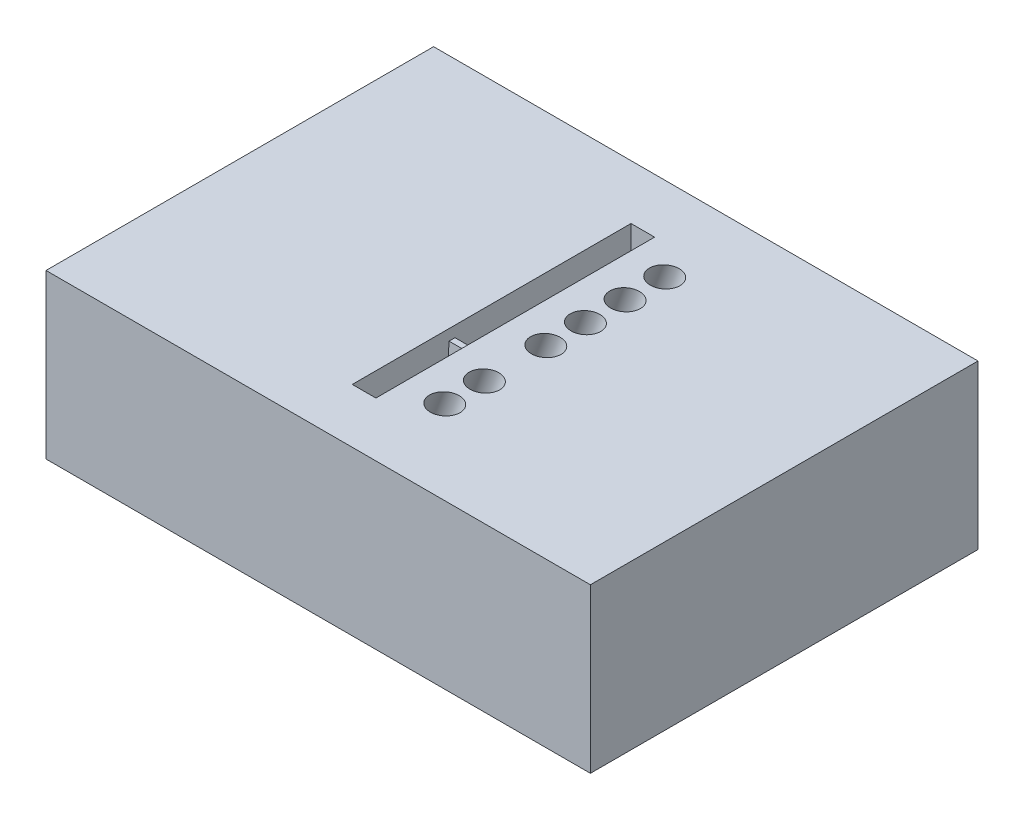
ISO-10303-21;
HEADER;
FILE_DESCRIPTION(('STEP AP214'),'2;1');
FILE_NAME('part.step','',(''),(''),'','','');
FILE_SCHEMA(('AUTOMOTIVE_DESIGN { 1 0 10303 214 1 1 1 1 }'));
ENDSEC;
DATA;
#1=APPLICATION_CONTEXT('core data for automotive mechanical design processes');
#2=APPLICATION_PROTOCOL_DEFINITION('international standard','automotive_design',2000,#1);
#3=PRODUCT_CONTEXT('',#1,'mechanical');
#4=PRODUCT('Part','Part','',(#3));
#5=PRODUCT_RELATED_PRODUCT_CATEGORY('part','',(#4));
#6=PRODUCT_DEFINITION_FORMATION('','',#4);
#7=PRODUCT_DEFINITION_CONTEXT('part definition',#1,'design');
#8=PRODUCT_DEFINITION('design','',#6,#7);
#9=PRODUCT_DEFINITION_SHAPE('','',#8);
#10=(LENGTH_UNIT() NAMED_UNIT(*) SI_UNIT(.MILLI.,.METRE.));
#11=(NAMED_UNIT(*) PLANE_ANGLE_UNIT() SI_UNIT($,.RADIAN.));
#12=(NAMED_UNIT(*) SI_UNIT($,.STERADIAN.) SOLID_ANGLE_UNIT());
#13=UNCERTAINTY_MEASURE_WITH_UNIT(LENGTH_MEASURE(1.E-05),#10,'distance_accuracy_value','');
#14=(GEOMETRIC_REPRESENTATION_CONTEXT(3) GLOBAL_UNCERTAINTY_ASSIGNED_CONTEXT((#13)) GLOBAL_UNIT_ASSIGNED_CONTEXT((#10,
#11,#12)) REPRESENTATION_CONTEXT('',''));
#15=CARTESIAN_POINT('',(0.,0.,0.));
#16=DIRECTION('',(0.,0.,1.));
#17=DIRECTION('',(1.,0.,0.));
#18=AXIS2_PLACEMENT_3D('',#15,#16,#17);
#19=CARTESIAN_POINT('',(0.300000000000002,-10.3,-12.8));
#20=DIRECTION('',(1.,0.,0.));
#21=DIRECTION('',(0.,0.,-1.));
#22=AXIS2_PLACEMENT_3D('',#19,#20,#21);
#23=PLANE('',#22);
#24=DIRECTION('',(0.,-0.998629534754574,0.0523359562429372));
#25=VECTOR('',#24,1.);
#26=CARTESIAN_POINT('',(0.300000000000001,-10.3,4.40036814007895));
#27=LINE('',#26,#25);
#28=CARTESIAN_POINT('',(0.300000000000002,-1.,3.91297579274672));
#29=VERTEX_POINT('',#28);
#30=CARTESIAN_POINT('',(0.300000000000002,-10.3,4.40036814007895));
#31=VERTEX_POINT('',#30);
#32=EDGE_CURVE('E174',#29,#31,#27,.T.);
#33=ORIENTED_EDGE('',*,*,#32,.T.);
#34=DIRECTION('',(0.,0.,-1.));
#35=VECTOR('',#34,1.);
#36=CARTESIAN_POINT('',(0.300000000000002,-10.3,-12.8));
#37=LINE('',#36,#35);
#38=CARTESIAN_POINT('',(0.300000000000002,-10.3,5.65842665136646));
#39=VERTEX_POINT('',#38);
#40=EDGE_CURVE('E767',#39,#31,#37,.T.);
#41=ORIENTED_EDGE('',*,*,#40,.F.);
#42=CARTESIAN_POINT('',(0.300000000000002,-9.9592774582631,6.46000000000001));
#43=DIRECTION('',(1.,0.,0.));
#44=DIRECTION('',(0.,1.,0.));
#45=AXIS2_PLACEMENT_3D('',#42,#43,#44);
#46=ELLIPSE('',#45,2.36828156413211,0.810000000000003);
#47=CARTESIAN_POINT('',(0.300000000000002,-10.3,7.26157334863355));
#48=VERTEX_POINT('',#47);
#49=EDGE_CURVE('E245',#48,#39,#46,.F.);
#50=ORIENTED_EDGE('',*,*,#49,.F.);
#51=CARTESIAN_POINT('',(0.300000000000002,-10.3,9.29842665136647));
#52=VERTEX_POINT('',#51);
#53=EDGE_CURVE('E292',#52,#48,#37,.T.);
#54=ORIENTED_EDGE('',*,*,#53,.F.);
#55=CARTESIAN_POINT('',(0.300000000000002,-9.9592774582631,10.1));
#56=DIRECTION('',(1.,0.,0.));
#57=DIRECTION('',(0.,1.,0.));
#58=AXIS2_PLACEMENT_3D('',#55,#56,#57);
#59=ELLIPSE('',#58,2.3682815641321,0.810000000000002);
#60=CARTESIAN_POINT('',(0.300000000000002,-10.3,10.9015733486336));
#61=VERTEX_POINT('',#60);
#62=EDGE_CURVE('E256',#61,#52,#59,.F.);
#63=ORIENTED_EDGE('',*,*,#62,.F.);
#64=CARTESIAN_POINT('',(0.300000000000002,-10.3,12.8));
#65=VERTEX_POINT('',#64);
#66=EDGE_CURVE('E288',#65,#61,#37,.T.);
#67=ORIENTED_EDGE('',*,*,#66,.F.);
#68=DIRECTION('',(0.,1.,0.));
#69=VECTOR('',#68,1.);
#70=CARTESIAN_POINT('',(0.300000000000002,-10.3,12.8));
#71=LINE('',#70,#69);
#72=CARTESIAN_POINT('',(0.300000000000002,0.,12.8));
#73=VERTEX_POINT('',#72);
#74=EDGE_CURVE('E313',#65,#73,#71,.T.);
#75=ORIENTED_EDGE('',*,*,#74,.T.);
#76=DIRECTION('',(0.,0.,-1.));
#77=VECTOR('',#76,1.);
#78=CARTESIAN_POINT('',(0.300000000000002,0.,-12.8));
#79=LINE('',#78,#77);
#80=CARTESIAN_POINT('',(0.300000000000002,0.,-12.8));
#81=VERTEX_POINT('',#80);
#82=EDGE_CURVE('E302',#73,#81,#79,.T.);
#83=ORIENTED_EDGE('',*,*,#82,.T.);
#84=DIRECTION('',(0.,1.,0.));
#85=VECTOR('',#84,1.);
#86=CARTESIAN_POINT('',(0.300000000000002,-10.3,-12.8));
#87=LINE('',#86,#85);
#88=CARTESIAN_POINT('',(0.300000000000002,-10.3,-12.8));
#89=VERTEX_POINT('',#88);
#90=EDGE_CURVE('E311',#89,#81,#87,.T.);
#91=ORIENTED_EDGE('',*,*,#90,.F.);
#92=CARTESIAN_POINT('',(0.300000000000002,-10.3,-10.9015733486336));
#93=VERTEX_POINT('',#92);
#94=EDGE_CURVE('E287',#93,#89,#37,.T.);
#95=ORIENTED_EDGE('',*,*,#94,.F.);
#96=CARTESIAN_POINT('',(0.300000000000002,-9.9592774582631,-10.1));
#97=DIRECTION('',(1.,0.,0.));
#98=DIRECTION('',(0.,1.,0.));
#99=AXIS2_PLACEMENT_3D('',#96,#97,#98);
#100=ELLIPSE('',#99,2.36828156413211,0.810000000000002);
#101=CARTESIAN_POINT('',(0.300000000000002,-10.3,-9.29842665136647));
#102=VERTEX_POINT('',#101);
#103=EDGE_CURVE('E201',#102,#93,#100,.F.);
#104=ORIENTED_EDGE('',*,*,#103,.F.);
#105=CARTESIAN_POINT('',(0.300000000000002,-10.3,-7.26157334863355));
#106=VERTEX_POINT('',#105);
#107=EDGE_CURVE('E765',#106,#102,#37,.T.);
#108=ORIENTED_EDGE('',*,*,#107,.F.);
#109=CARTESIAN_POINT('',(0.300000000000002,-9.9592774582631,-6.46000000000001));
#110=DIRECTION('',(1.,0.,0.));
#111=DIRECTION('',(0.,1.,0.));
#112=AXIS2_PLACEMENT_3D('',#109,#110,#111);
#113=ELLIPSE('',#112,2.36828156413211,0.810000000000002);
#114=CARTESIAN_POINT('',(0.300000000000002,-10.3,-5.65842665136647));
#115=VERTEX_POINT('',#114);
#116=EDGE_CURVE('E212',#115,#106,#113,.F.);
#117=ORIENTED_EDGE('',*,*,#116,.F.);
#118=CARTESIAN_POINT('',(0.300000000000002,-10.3,-3.62157334863355));
#119=VERTEX_POINT('',#118);
#120=EDGE_CURVE('E766',#119,#115,#37,.T.);
#121=ORIENTED_EDGE('',*,*,#120,.F.);
#122=CARTESIAN_POINT('',(0.300000000000002,-9.9592774582631,-2.82));
#123=DIRECTION('',(1.,0.,0.));
#124=DIRECTION('',(0.,1.,0.));
#125=AXIS2_PLACEMENT_3D('',#122,#123,#124);
#126=ELLIPSE('',#125,2.36828156413211,0.810000000000003);
#127=CARTESIAN_POINT('',(0.300000000000002,-10.3,-2.01842665136646));
#128=VERTEX_POINT('',#127);
#129=EDGE_CURVE('E223',#128,#119,#126,.F.);
#130=ORIENTED_EDGE('',*,*,#129,.F.);
#131=CARTESIAN_POINT('',(0.300000000000002,-10.3,0.0184266513664592));
#132=VERTEX_POINT('',#131);
#133=EDGE_CURVE('E768',#132,#128,#37,.T.);
#134=ORIENTED_EDGE('',*,*,#133,.F.);
#135=CARTESIAN_POINT('',(0.300000000000002,-9.9592774582631,0.820000000000001));
#136=DIRECTION('',(1.,0.,0.));
#137=DIRECTION('',(0.,1.,0.));
#138=AXIS2_PLACEMENT_3D('',#135,#136,#137);
#139=ELLIPSE('',#138,2.36828156413211,0.810000000000003);
#140=CARTESIAN_POINT('',(0.300000000000002,-10.3,1.62157334863354));
#141=VERTEX_POINT('',#140);
#142=EDGE_CURVE('E234',#141,#132,#139,.F.);
#143=ORIENTED_EDGE('',*,*,#142,.F.);
#144=CARTESIAN_POINT('',(0.300000000000002,-10.3,2.87963185992106));
#145=VERTEX_POINT('',#144);
#146=EDGE_CURVE('E293',#145,#141,#37,.T.);
#147=ORIENTED_EDGE('',*,*,#146,.F.);
#148=DIRECTION('',(0.,0.998629534754574,0.052335956242937));
#149=VECTOR('',#148,1.);
#150=CARTESIAN_POINT('',(0.300000000000001,-1.,3.36702420725328));
#151=LINE('',#150,#149);
#152=CARTESIAN_POINT('',(0.300000000000002,-1.,3.36702420725328));
#153=VERTEX_POINT('',#152);
#154=EDGE_CURVE('E50',#145,#153,#151,.T.);
#155=ORIENTED_EDGE('',*,*,#154,.T.);
#156=DIRECTION('',(0.,0.,1.));
#157=VECTOR('',#156,1.);
#158=CARTESIAN_POINT('',(0.300000000000001,-1.,3.91297579274673));
#159=LINE('',#158,#157);
#160=EDGE_CURVE('E55',#153,#29,#159,.T.);
#161=ORIENTED_EDGE('',*,*,#160,.T.);
#162=EDGE_LOOP('',(#33,#41,#50,#54,#63,#67,#75,#83,#91,#95,#104,#108,#117,#121,#130,#134,#143,
#147,#155,#161));
#163=FACE_BOUND('',#162,.T.);
#164=ADVANCED_FACE('F33',(#163),#23,.F.);
#165=CARTESIAN_POINT('',(0.,-10.3,0.));
#166=DIRECTION('',(0.,1.,0.));
#167=DIRECTION('',(0.,0.,1.));
#168=AXIS2_PLACEMENT_3D('',#165,#166,#167);
#169=PLANE('',#168);
#170=ORIENTED_EDGE('',*,*,#40,.T.);
#171=DIRECTION('',(-1.,0.,0.));
#172=VECTOR('',#171,1.);
#173=CARTESIAN_POINT('',(0.300000000000001,-10.3,4.40036814007895));
#174=LINE('',#173,#172);
#175=CARTESIAN_POINT('',(-1.87,-10.3,4.40036814007895));
#176=VERTEX_POINT('',#175);
#177=EDGE_CURVE('E190',#31,#176,#174,.T.);
#178=ORIENTED_EDGE('',*,*,#177,.T.);
#179=DIRECTION('',(0.,0.,1.));
#180=VECTOR('',#179,1.);
#181=CARTESIAN_POINT('',(-1.87,-10.3,-12.8));
#182=LINE('',#181,#180);
#183=CARTESIAN_POINT('',(-1.87,-10.3,12.8));
#184=VERTEX_POINT('',#183);
#185=EDGE_CURVE('E166',#176,#184,#182,.T.);
#186=ORIENTED_EDGE('',*,*,#185,.T.);
#187=DIRECTION('',(1.,0.,0.));
#188=VECTOR('',#187,1.);
#189=CARTESIAN_POINT('',(-1.87,-10.3,12.8));
#190=LINE('',#189,#188);
#191=EDGE_CURVE('E284',#184,#65,#190,.T.);
#192=ORIENTED_EDGE('',*,*,#191,.T.);
#193=ORIENTED_EDGE('',*,*,#66,.T.);
#194=CARTESIAN_POINT('',(0.175987136664245,-10.3,10.1));
#195=DIRECTION('',(0.,1.,0.));
#196=DIRECTION('',(1.,0.,0.));
#197=AXIS2_PLACEMENT_3D('',#194,#195,#196);
#198=ELLIPSE('',#197,0.861983995705491,0.810000000000002);
#199=EDGE_CURVE('E251',#61,#52,#198,.F.);
#200=ORIENTED_EDGE('',*,*,#199,.T.);
#201=ORIENTED_EDGE('',*,*,#53,.T.);
#202=CARTESIAN_POINT('',(0.175987136664245,-10.3,6.46000000000001));
#203=DIRECTION('',(0.,1.,0.));
#204=DIRECTION('',(1.,0.,0.));
#205=AXIS2_PLACEMENT_3D('',#202,#203,#204);
#206=ELLIPSE('',#205,0.861983995705492,0.810000000000003);
#207=EDGE_CURVE('E240',#48,#39,#206,.F.);
#208=ORIENTED_EDGE('',*,*,#207,.T.);
#209=EDGE_LOOP('',(#170,#178,#186,#192,#193,#200,#201,#208));
#210=FACE_BOUND('',#209,.T.);
#211=ADVANCED_FACE('F400',(#210),#169,.T.);
#212=CARTESIAN_POINT('',(-1.87,-10.3,-12.8));
#213=VERTEX_POINT('',#212);
#214=CARTESIAN_POINT('',(-1.87,-10.3,2.87963185992106));
#215=VERTEX_POINT('',#214);
#216=EDGE_CURVE('E281',#213,#215,#182,.T.);
#217=ORIENTED_EDGE('',*,*,#216,.T.);
#218=DIRECTION('',(-1.,0.,0.));
#219=VECTOR('',#218,1.);
#220=CARTESIAN_POINT('',(0.300000000000001,-10.3,2.87963185992106));
#221=LINE('',#220,#219);
#222=EDGE_CURVE('E187',#145,#215,#221,.T.);
#223=ORIENTED_EDGE('',*,*,#222,.F.);
#224=ORIENTED_EDGE('',*,*,#146,.T.);
#225=CARTESIAN_POINT('',(0.175987136664245,-10.3,0.820000000000001));
#226=DIRECTION('',(0.,1.,0.));
#227=DIRECTION('',(1.,0.,0.));
#228=AXIS2_PLACEMENT_3D('',#225,#226,#227);
#229=ELLIPSE('',#228,0.861983995705492,0.810000000000003);
#230=EDGE_CURVE('E229',#141,#132,#229,.F.);
#231=ORIENTED_EDGE('',*,*,#230,.T.);
#232=ORIENTED_EDGE('',*,*,#133,.T.);
#233=CARTESIAN_POINT('',(0.175987136664245,-10.3,-2.82));
#234=DIRECTION('',(0.,1.,0.));
#235=DIRECTION('',(1.,0.,0.));
#236=AXIS2_PLACEMENT_3D('',#233,#234,#235);
#237=ELLIPSE('',#236,0.861983995705492,0.810000000000003);
#238=EDGE_CURVE('E218',#128,#119,#237,.F.);
#239=ORIENTED_EDGE('',*,*,#238,.T.);
#240=ORIENTED_EDGE('',*,*,#120,.T.);
#241=CARTESIAN_POINT('',(0.175987136664245,-10.3,-6.46000000000001));
#242=DIRECTION('',(0.,1.,0.));
#243=DIRECTION('',(1.,0.,0.));
#244=AXIS2_PLACEMENT_3D('',#241,#242,#243);
#245=ELLIPSE('',#244,0.861983995705491,0.810000000000002);
#246=EDGE_CURVE('E207',#115,#106,#245,.F.);
#247=ORIENTED_EDGE('',*,*,#246,.T.);
#248=ORIENTED_EDGE('',*,*,#107,.T.);
#249=CARTESIAN_POINT('',(0.175987136664245,-10.3,-10.1));
#250=DIRECTION('',(0.,1.,0.));
#251=DIRECTION('',(1.,0.,0.));
#252=AXIS2_PLACEMENT_3D('',#249,#250,#251);
#253=ELLIPSE('',#252,0.861983995705491,0.810000000000002);
#254=EDGE_CURVE('E196',#102,#93,#253,.F.);
#255=ORIENTED_EDGE('',*,*,#254,.T.);
#256=ORIENTED_EDGE('',*,*,#94,.T.);
#257=DIRECTION('',(-1.,0.,0.));
#258=VECTOR('',#257,1.);
#259=CARTESIAN_POINT('',(-1.87,-10.3,-12.8));
#260=LINE('',#259,#258);
#261=EDGE_CURVE('E291',#89,#213,#260,.T.);
#262=ORIENTED_EDGE('',*,*,#261,.T.);
#263=EDGE_LOOP('',(#217,#223,#224,#231,#232,#239,#240,#247,#248,#255,#256,#262));
#264=FACE_BOUND('',#263,.T.);
#265=ADVANCED_FACE('F405',(#264),#169,.T.);
#266=CARTESIAN_POINT('',(-1.87,-10.3,-12.8));
#267=DIRECTION('',(-1.,0.,0.));
#268=DIRECTION('',(0.,0.,1.));
#269=AXIS2_PLACEMENT_3D('',#266,#267,#268);
#270=PLANE('',#269);
#271=DIRECTION('',(0.,-0.998629534754574,0.0523359562429372));
#272=VECTOR('',#271,1.);
#273=CARTESIAN_POINT('',(-1.87,-10.3,4.40036814007895));
#274=LINE('',#273,#272);
#275=CARTESIAN_POINT('',(-1.87,-1.,3.91297579274673));
#276=VERTEX_POINT('',#275);
#277=EDGE_CURVE('E159',#276,#176,#274,.T.);
#278=ORIENTED_EDGE('',*,*,#277,.F.);
#279=DIRECTION('',(0.,0.,1.));
#280=VECTOR('',#279,1.);
#281=CARTESIAN_POINT('',(-1.87,-1.,3.91297579274673));
#282=LINE('',#281,#280);
#283=CARTESIAN_POINT('',(-1.87,-1.,3.36702420725328));
#284=VERTEX_POINT('',#283);
#285=EDGE_CURVE('E163',#284,#276,#282,.T.);
#286=ORIENTED_EDGE('',*,*,#285,.F.);
#287=DIRECTION('',(0.,0.998629534754574,0.052335956242937));
#288=VECTOR('',#287,1.);
#289=CARTESIAN_POINT('',(-1.87,-1.,3.36702420725328));
#290=LINE('',#289,#288);
#291=EDGE_CURVE('E169',#215,#284,#290,.T.);
#292=ORIENTED_EDGE('',*,*,#291,.F.);
#293=ORIENTED_EDGE('',*,*,#216,.F.);
#294=DIRECTION('',(0.,1.,0.));
#295=VECTOR('',#294,1.);
#296=CARTESIAN_POINT('',(-1.87,-10.3,-12.8));
#297=LINE('',#296,#295);
#298=CARTESIAN_POINT('',(-1.87,0.,-12.8));
#299=VERTEX_POINT('',#298);
#300=EDGE_CURVE('E308',#213,#299,#297,.T.);
#301=ORIENTED_EDGE('',*,*,#300,.T.);
#302=DIRECTION('',(0.,0.,1.));
#303=VECTOR('',#302,1.);
#304=CARTESIAN_POINT('',(-1.87,0.,-12.8));
#305=LINE('',#304,#303);
#306=CARTESIAN_POINT('',(-1.87,0.,12.8));
#307=VERTEX_POINT('',#306);
#308=EDGE_CURVE('E297',#299,#307,#305,.T.);
#309=ORIENTED_EDGE('',*,*,#308,.T.);
#310=DIRECTION('',(0.,1.,0.));
#311=VECTOR('',#310,1.);
#312=CARTESIAN_POINT('',(-1.87,-10.3,12.8));
#313=LINE('',#312,#311);
#314=EDGE_CURVE('E296',#184,#307,#313,.T.);
#315=ORIENTED_EDGE('',*,*,#314,.F.);
#316=ORIENTED_EDGE('',*,*,#185,.F.);
#317=EDGE_LOOP('',(#278,#286,#292,#293,#301,#309,#315,#316));
#318=FACE_BOUND('',#317,.T.);
#319=ADVANCED_FACE('F161',(#318),#270,.F.);
#320=CARTESIAN_POINT('',(2.28504078760609,-4.50542271761894,-10.1));
#321=DIRECTION('',(-0.342020143325669,-0.939692620785908,0.));
#322=DIRECTION('',(0.939692620785908,-0.342020143325669,0.));
#323=AXIS2_PLACEMENT_3D('',#320,#321,#322);
#324=PLANE('',#323);
#325=CARTESIAN_POINT('',(2.28504078760609,-4.50542271761894,-10.1));
#326=DIRECTION('',(-0.342020143325669,-0.939692620785908,0.));
#327=DIRECTION('',(0.939692620785908,-0.342020143325669,0.));
#328=AXIS2_PLACEMENT_3D('',#325,#326,#327);
#329=CIRCLE('',#328,1.32);
#330=CARTESIAN_POINT('',(3.5254350470435,-4.95688930680883,-10.1));
#331=VERTEX_POINT('',#330);
#332=EDGE_CURVE('E277',#331,#331,#329,.T.);
#333=ORIENTED_EDGE('',*,*,#332,.F.);
#334=EDGE_LOOP('',(#333));
#335=FACE_BOUND('',#334,.T.);
#336=CARTESIAN_POINT('',(2.28504078760609,-4.50542271761894,-10.1));
#337=DIRECTION('',(-0.342020143325669,-0.939692620785908,0.));
#338=DIRECTION('',(0.939692620785908,-0.342020143325669,0.));
#339=AXIS2_PLACEMENT_3D('',#336,#337,#338);
#340=CIRCLE('',#339,0.810000000000002);
#341=CARTESIAN_POINT('',(3.04619181044268,-4.78245903371274,-10.1));
#342=VERTEX_POINT('',#341);
#343=EDGE_CURVE('E192',#342,#342,#340,.T.);
#344=ORIENTED_EDGE('',*,*,#343,.T.);
#345=EDGE_LOOP('',(#344));
#346=FACE_BOUND('',#345,.T.);
#347=ADVANCED_FACE('F415',(#335,#346),#324,.F.);
#348=CARTESIAN_POINT('',(2.28504078760609,-4.50542271761894,-6.46000000000001));
#349=DIRECTION('',(-0.342020143325669,-0.939692620785908,0.));
#350=DIRECTION('',(0.939692620785908,-0.342020143325669,0.));
#351=AXIS2_PLACEMENT_3D('',#348,#349,#350);
#352=PLANE('',#351);
#353=CARTESIAN_POINT('',(2.28504078760609,-4.50542271761894,-6.46000000000001));
#354=DIRECTION('',(-0.342020143325669,-0.939692620785908,0.));
#355=DIRECTION('',(0.939692620785908,-0.342020143325669,0.));
#356=AXIS2_PLACEMENT_3D('',#353,#354,#355);
#357=CIRCLE('',#356,1.32);
#358=CARTESIAN_POINT('',(3.5254350470435,-4.95688930680883,-6.46000000000001));
#359=VERTEX_POINT('',#358);
#360=EDGE_CURVE('E269',#359,#359,#357,.T.);
#361=ORIENTED_EDGE('',*,*,#360,.F.);
#362=EDGE_LOOP('',(#361));
#363=FACE_BOUND('',#362,.T.);
#364=CARTESIAN_POINT('',(2.28504078760609,-4.50542271761894,-6.46000000000001));
#365=DIRECTION('',(-0.342020143325669,-0.939692620785908,0.));
#366=DIRECTION('',(0.939692620785908,-0.342020143325669,0.));
#367=AXIS2_PLACEMENT_3D('',#364,#365,#366);
#368=CIRCLE('',#367,0.810000000000002);
#369=CARTESIAN_POINT('',(3.04619181044268,-4.78245903371274,-6.46000000000001));
#370=VERTEX_POINT('',#369);
#371=EDGE_CURVE('E203',#370,#370,#368,.T.);
#372=ORIENTED_EDGE('',*,*,#371,.T.);
#373=EDGE_LOOP('',(#372));
#374=FACE_BOUND('',#373,.T.);
#375=ADVANCED_FACE('F420',(#363,#374),#352,.F.);
#376=CARTESIAN_POINT('',(2.28504078760609,-4.50542271761894,-2.82));
#377=DIRECTION('',(-0.342020143325669,-0.939692620785908,0.));
#378=DIRECTION('',(0.939692620785908,-0.342020143325669,0.));
#379=AXIS2_PLACEMENT_3D('',#376,#377,#378);
#380=PLANE('',#379);
#381=CARTESIAN_POINT('',(2.28504078760609,-4.50542271761894,-2.82));
#382=DIRECTION('',(-0.342020143325669,-0.939692620785908,0.));
#383=DIRECTION('',(0.939692620785908,-0.342020143325669,0.));
#384=AXIS2_PLACEMENT_3D('',#381,#382,#383);
#385=CIRCLE('',#384,1.32);
#386=CARTESIAN_POINT('',(3.5254350470435,-4.95688930680883,-2.82));
#387=VERTEX_POINT('',#386);
#388=EDGE_CURVE('E273',#387,#387,#385,.T.);
#389=ORIENTED_EDGE('',*,*,#388,.F.);
#390=EDGE_LOOP('',(#389));
#391=FACE_BOUND('',#390,.T.);
#392=CARTESIAN_POINT('',(2.28504078760609,-4.50542271761894,-2.82));
#393=DIRECTION('',(-0.342020143325669,-0.939692620785908,0.));
#394=DIRECTION('',(0.939692620785908,-0.342020143325669,0.));
#395=AXIS2_PLACEMENT_3D('',#392,#393,#394);
#396=CIRCLE('',#395,0.810000000000003);
#397=CARTESIAN_POINT('',(3.04619181044268,-4.78245903371274,-2.82));
#398=VERTEX_POINT('',#397);
#399=EDGE_CURVE('E214',#398,#398,#396,.T.);
#400=ORIENTED_EDGE('',*,*,#399,.T.);
#401=EDGE_LOOP('',(#400));
#402=FACE_BOUND('',#401,.T.);
#403=ADVANCED_FACE('F435',(#391,#402),#380,.F.);
#404=CARTESIAN_POINT('',(2.28504078760609,-4.50542271761894,0.820000000000002));
#405=DIRECTION('',(-0.342020143325669,-0.939692620785908,0.));
#406=DIRECTION('',(0.939692620785908,-0.342020143325669,0.));
#407=AXIS2_PLACEMENT_3D('',#404,#405,#406);
#408=PLANE('',#407);
#409=CARTESIAN_POINT('',(2.28504078760609,-4.50542271761894,0.820000000000002));
#410=DIRECTION('',(-0.342020143325669,-0.939692620785908,0.));
#411=DIRECTION('',(0.939692620785908,-0.342020143325669,0.));
#412=AXIS2_PLACEMENT_3D('',#409,#410,#411);
#413=CIRCLE('',#412,1.32);
#414=CARTESIAN_POINT('',(3.5254350470435,-4.95688930680883,0.820000000000002));
#415=VERTEX_POINT('',#414);
#416=EDGE_CURVE('E265',#415,#415,#413,.T.);
#417=ORIENTED_EDGE('',*,*,#416,.F.);
#418=EDGE_LOOP('',(#417));
#419=FACE_BOUND('',#418,.T.);
#420=CARTESIAN_POINT('',(2.28504078760609,-4.50542271761894,0.820000000000002));
#421=DIRECTION('',(-0.342020143325669,-0.939692620785908,0.));
#422=DIRECTION('',(0.939692620785908,-0.342020143325669,0.));
#423=AXIS2_PLACEMENT_3D('',#420,#421,#422);
#424=CIRCLE('',#423,0.810000000000003);
#425=CARTESIAN_POINT('',(3.04619181044268,-4.78245903371274,0.820000000000002));
#426=VERTEX_POINT('',#425);
#427=EDGE_CURVE('E225',#426,#426,#424,.T.);
#428=ORIENTED_EDGE('',*,*,#427,.T.);
#429=EDGE_LOOP('',(#428));
#430=FACE_BOUND('',#429,.T.);
#431=ADVANCED_FACE('F438',(#419,#430),#408,.F.);
#432=CARTESIAN_POINT('',(2.28504078760609,-4.50542271761895,6.46000000000001));
#433=DIRECTION('',(-0.342020143325669,-0.939692620785908,0.));
#434=DIRECTION('',(0.939692620785908,-0.342020143325669,0.));
#435=AXIS2_PLACEMENT_3D('',#432,#433,#434);
#436=PLANE('',#435);
#437=CARTESIAN_POINT('',(2.28504078760609,-4.50542271761895,6.46000000000001));
#438=DIRECTION('',(-0.342020143325669,-0.939692620785908,0.));
#439=DIRECTION('',(0.939692620785908,-0.342020143325669,0.));
#440=AXIS2_PLACEMENT_3D('',#437,#438,#439);
#441=CIRCLE('',#440,1.32);
#442=CARTESIAN_POINT('',(3.5254350470435,-4.95688930680883,6.46000000000001));
#443=VERTEX_POINT('',#442);
#444=EDGE_CURVE('E261',#443,#443,#441,.T.);
#445=ORIENTED_EDGE('',*,*,#444,.F.);
#446=EDGE_LOOP('',(#445));
#447=FACE_BOUND('',#446,.T.);
#448=CARTESIAN_POINT('',(2.28504078760609,-4.50542271761895,6.46000000000001));
#449=DIRECTION('',(-0.342020143325669,-0.939692620785908,0.));
#450=DIRECTION('',(0.939692620785908,-0.342020143325669,0.));
#451=AXIS2_PLACEMENT_3D('',#448,#449,#450);
#452=CIRCLE('',#451,0.810000000000003);
#453=CARTESIAN_POINT('',(3.04619181044268,-4.78245903371274,6.46000000000001));
#454=VERTEX_POINT('',#453);
#455=EDGE_CURVE('E236',#454,#454,#452,.T.);
#456=ORIENTED_EDGE('',*,*,#455,.T.);
#457=EDGE_LOOP('',(#456));
#458=FACE_BOUND('',#457,.T.);
#459=ADVANCED_FACE('F452',(#447,#458),#436,.F.);
#460=CARTESIAN_POINT('',(2.28504078760609,-4.50542271761895,10.1));
#461=DIRECTION('',(-0.342020143325669,-0.939692620785908,0.));
#462=DIRECTION('',(0.939692620785908,-0.342020143325669,0.));
#463=AXIS2_PLACEMENT_3D('',#460,#461,#462);
#464=PLANE('',#463);
#465=CARTESIAN_POINT('',(2.28504078760609,-4.50542271761895,10.1));
#466=DIRECTION('',(-0.342020143325669,-0.939692620785908,0.));
#467=DIRECTION('',(0.939692620785908,-0.342020143325669,0.));
#468=AXIS2_PLACEMENT_3D('',#465,#466,#467);
#469=CIRCLE('',#468,1.32);
#470=CARTESIAN_POINT('',(3.5254350470435,-4.95688930680883,10.1));
#471=VERTEX_POINT('',#470);
#472=EDGE_CURVE('E258',#471,#471,#469,.T.);
#473=ORIENTED_EDGE('',*,*,#472,.F.);
#474=EDGE_LOOP('',(#473));
#475=FACE_BOUND('',#474,.T.);
#476=CARTESIAN_POINT('',(2.28504078760609,-4.50542271761895,10.1));
#477=DIRECTION('',(-0.342020143325669,-0.939692620785908,0.));
#478=DIRECTION('',(0.939692620785908,-0.342020143325669,0.));
#479=AXIS2_PLACEMENT_3D('',#476,#477,#478);
#480=CIRCLE('',#479,0.810000000000002);
#481=CARTESIAN_POINT('',(3.04619181044268,-4.78245903371274,10.1));
#482=VERTEX_POINT('',#481);
#483=EDGE_CURVE('E247',#482,#482,#480,.T.);
#484=ORIENTED_EDGE('',*,*,#483,.T.);
#485=EDGE_LOOP('',(#484));
#486=FACE_BOUND('',#485,.T.);
#487=ADVANCED_FACE('F459',(#475,#486),#464,.F.);
#488=CARTESIAN_POINT('',(25.,-15.,17.8));
#489=DIRECTION('',(1.,0.,0.));
#490=DIRECTION('',(0.,0.,-1.));
#491=AXIS2_PLACEMENT_3D('',#488,#489,#490);
#492=PLANE('',#491);
#493=DIRECTION('',(0.,0.,-1.));
#494=VECTOR('',#493,1.);
#495=CARTESIAN_POINT('',(25.,0.,17.8));
#496=LINE('',#495,#494);
#497=CARTESIAN_POINT('',(25.,0.,17.8));
#498=VERTEX_POINT('',#497);
#499=CARTESIAN_POINT('',(25.,0.,-17.8));
#500=VERTEX_POINT('',#499);
#501=EDGE_CURVE('E310',#498,#500,#496,.T.);
#502=ORIENTED_EDGE('',*,*,#501,.F.);
#503=DIRECTION('',(0.,1.,0.));
#504=VECTOR('',#503,1.);
#505=CARTESIAN_POINT('',(25.,-15.,17.8));
#506=LINE('',#505,#504);
#507=CARTESIAN_POINT('',(25.,-15.,17.8));
#508=VERTEX_POINT('',#507);
#509=EDGE_CURVE('E11',#508,#498,#506,.T.);
#510=ORIENTED_EDGE('',*,*,#509,.F.);
#511=DIRECTION('',(0.,0.,-1.));
#512=VECTOR('',#511,1.);
#513=CARTESIAN_POINT('',(25.,-15.,17.8));
#514=LINE('',#513,#512);
#515=CARTESIAN_POINT('',(25.,-15.,-17.8));
#516=VERTEX_POINT('',#515);
#517=EDGE_CURVE('E317',#508,#516,#514,.T.);
#518=ORIENTED_EDGE('',*,*,#517,.T.);
#519=DIRECTION('',(0.,1.,0.));
#520=VECTOR('',#519,1.);
#521=CARTESIAN_POINT('',(25.,-15.,-17.8));
#522=LINE('',#521,#520);
#523=EDGE_CURVE('E330',#516,#500,#522,.T.);
#524=ORIENTED_EDGE('',*,*,#523,.T.);
#525=EDGE_LOOP('',(#502,#510,#518,#524));
#526=FACE_BOUND('',#525,.T.);
#527=ADVANCED_FACE('F35',(#526),#492,.T.);
#528=CARTESIAN_POINT('',(25.,-15.,17.8));
#529=DIRECTION('',(0.,0.,1.));
#530=DIRECTION('',(1.,0.,0.));
#531=AXIS2_PLACEMENT_3D('',#528,#529,#530);
#532=PLANE('',#531);
#533=DIRECTION('',(1.,0.,0.));
#534=VECTOR('',#533,1.);
#535=CARTESIAN_POINT('',(25.,0.,17.8));
#536=LINE('',#535,#534);
#537=CARTESIAN_POINT('',(-25.,0.,17.8));
#538=VERTEX_POINT('',#537);
#539=EDGE_CURVE('E321',#538,#498,#536,.T.);
#540=ORIENTED_EDGE('',*,*,#539,.F.);
#541=DIRECTION('',(0.,1.,0.));
#542=VECTOR('',#541,1.);
#543=CARTESIAN_POINT('',(-25.,-15.,17.8));
#544=LINE('',#543,#542);
#545=CARTESIAN_POINT('',(-25.,-15.,17.8));
#546=VERTEX_POINT('',#545);
#547=EDGE_CURVE('E42',#546,#538,#544,.T.);
#548=ORIENTED_EDGE('',*,*,#547,.F.);
#549=DIRECTION('',(1.,0.,0.));
#550=VECTOR('',#549,1.);
#551=CARTESIAN_POINT('',(25.,-15.,17.8));
#552=LINE('',#551,#550);
#553=EDGE_CURVE('E327',#546,#508,#552,.T.);
#554=ORIENTED_EDGE('',*,*,#553,.T.);
#555=ORIENTED_EDGE('',*,*,#509,.T.);
#556=EDGE_LOOP('',(#540,#548,#554,#555));
#557=FACE_BOUND('',#556,.T.);
#558=ADVANCED_FACE('F390',(#557),#532,.T.);
#559=CARTESIAN_POINT('',(-25.,-15.,17.8));
#560=DIRECTION('',(-1.,0.,0.));
#561=DIRECTION('',(0.,0.,1.));
#562=AXIS2_PLACEMENT_3D('',#559,#560,#561);
#563=PLANE('',#562);
#564=DIRECTION('',(0.,0.,1.));
#565=VECTOR('',#564,1.);
#566=CARTESIAN_POINT('',(-25.,0.,17.8));
#567=LINE('',#566,#565);
#568=CARTESIAN_POINT('',(-25.,0.,-17.8));
#569=VERTEX_POINT('',#568);
#570=EDGE_CURVE('E336',#569,#538,#567,.T.);
#571=ORIENTED_EDGE('',*,*,#570,.F.);
#572=DIRECTION('',(0.,1.,0.));
#573=VECTOR('',#572,1.);
#574=CARTESIAN_POINT('',(-25.,-15.,-17.8));
#575=LINE('',#574,#573);
#576=CARTESIAN_POINT('',(-25.,-15.,-17.8));
#577=VERTEX_POINT('',#576);
#578=EDGE_CURVE('E342',#577,#569,#575,.T.);
#579=ORIENTED_EDGE('',*,*,#578,.F.);
#580=DIRECTION('',(0.,0.,1.));
#581=VECTOR('',#580,1.);
#582=CARTESIAN_POINT('',(-25.,-15.,17.8));
#583=LINE('',#582,#581);
#584=EDGE_CURVE('E324',#577,#546,#583,.T.);
#585=ORIENTED_EDGE('',*,*,#584,.T.);
#586=ORIENTED_EDGE('',*,*,#547,.T.);
#587=EDGE_LOOP('',(#571,#579,#585,#586));
#588=FACE_BOUND('',#587,.T.);
#589=ADVANCED_FACE('F388',(#588),#563,.T.);
#590=CARTESIAN_POINT('',(25.,-15.,-17.8));
#591=DIRECTION('',(0.,0.,-1.));
#592=DIRECTION('',(-1.,0.,0.));
#593=AXIS2_PLACEMENT_3D('',#590,#591,#592);
#594=PLANE('',#593);
#595=DIRECTION('',(-1.,0.,0.));
#596=VECTOR('',#595,1.);
#597=CARTESIAN_POINT('',(25.,0.,-17.8));
#598=LINE('',#597,#596);
#599=EDGE_CURVE('E333',#500,#569,#598,.T.);
#600=ORIENTED_EDGE('',*,*,#599,.F.);
#601=ORIENTED_EDGE('',*,*,#523,.F.);
#602=DIRECTION('',(-1.,0.,0.));
#603=VECTOR('',#602,1.);
#604=CARTESIAN_POINT('',(25.,-15.,-17.8));
#605=LINE('',#604,#603);
#606=EDGE_CURVE('E320',#516,#577,#605,.T.);
#607=ORIENTED_EDGE('',*,*,#606,.T.);
#608=ORIENTED_EDGE('',*,*,#578,.T.);
#609=EDGE_LOOP('',(#600,#601,#607,#608));
#610=FACE_BOUND('',#609,.T.);
#611=ADVANCED_FACE('F384',(#610),#594,.T.);
#612=CARTESIAN_POINT('',(0.,-15.,0.));
#613=DIRECTION('',(0.,1.,0.));
#614=DIRECTION('',(0.,0.,1.));
#615=AXIS2_PLACEMENT_3D('',#612,#613,#614);
#616=PLANE('',#615);
#617=ORIENTED_EDGE('',*,*,#517,.F.);
#618=ORIENTED_EDGE('',*,*,#553,.F.);
#619=ORIENTED_EDGE('',*,*,#584,.F.);
#620=ORIENTED_EDGE('',*,*,#606,.F.);
#621=EDGE_LOOP('',(#617,#618,#619,#620));
#622=FACE_BOUND('',#621,.T.);
#623=ADVANCED_FACE('F362',(#622),#616,.F.);
#624=CARTESIAN_POINT('',(0.,0.,0.));
#625=DIRECTION('',(0.,1.,0.));
#626=DIRECTION('',(0.,0.,1.));
#627=AXIS2_PLACEMENT_3D('',#624,#625,#626);
#628=PLANE('',#627);
#629=CARTESIAN_POINT('',(3.92488054960613,0.,10.1));
#630=DIRECTION('',(0.,1.,0.));
#631=DIRECTION('',(-1.,0.,0.));
#632=AXIS2_PLACEMENT_3D('',#629,#630,#631);
#633=ELLIPSE('',#632,1.40471465966821,1.32);
#634=CARTESIAN_POINT('',(2.52016588993793,0.,10.1));
#635=VERTEX_POINT('',#634);
#636=EDGE_CURVE('E37',#635,#635,#633,.T.);
#637=ORIENTED_EDGE('',*,*,#636,.F.);
#638=EDGE_LOOP('',(#637));
#639=FACE_BOUND('',#638,.T.);
#640=CARTESIAN_POINT('',(3.92488054960613,0.,6.46000000000001));
#641=DIRECTION('',(0.,1.,0.));
#642=DIRECTION('',(-1.,0.,0.));
#643=AXIS2_PLACEMENT_3D('',#640,#641,#642);
#644=ELLIPSE('',#643,1.40471465966821,1.32);
#645=CARTESIAN_POINT('',(2.52016588993793,0.,6.46000000000001));
#646=VERTEX_POINT('',#645);
#647=EDGE_CURVE('E264',#646,#646,#644,.T.);
#648=ORIENTED_EDGE('',*,*,#647,.F.);
#649=EDGE_LOOP('',(#648));
#650=FACE_BOUND('',#649,.T.);
#651=CARTESIAN_POINT('',(3.92488054960613,0.,0.820000000000003));
#652=DIRECTION('',(0.,1.,0.));
#653=DIRECTION('',(-1.,0.,0.));
#654=AXIS2_PLACEMENT_3D('',#651,#652,#653);
#655=ELLIPSE('',#654,1.40471465966821,1.32);
#656=CARTESIAN_POINT('',(2.52016588993793,0.,0.820000000000002));
#657=VERTEX_POINT('',#656);
#658=EDGE_CURVE('E268',#657,#657,#655,.T.);
#659=ORIENTED_EDGE('',*,*,#658,.F.);
#660=EDGE_LOOP('',(#659));
#661=FACE_BOUND('',#660,.T.);
#662=CARTESIAN_POINT('',(3.92488054960613,0.,-6.46000000000001));
#663=DIRECTION('',(0.,1.,0.));
#664=DIRECTION('',(-1.,0.,0.));
#665=AXIS2_PLACEMENT_3D('',#662,#663,#664);
#666=ELLIPSE('',#665,1.40471465966821,1.32);
#667=CARTESIAN_POINT('',(2.52016588993792,0.,-6.46000000000001));
#668=VERTEX_POINT('',#667);
#669=EDGE_CURVE('E272',#668,#668,#666,.T.);
#670=ORIENTED_EDGE('',*,*,#669,.F.);
#671=EDGE_LOOP('',(#670));
#672=FACE_BOUND('',#671,.T.);
#673=CARTESIAN_POINT('',(3.92488054960613,0.,-2.82));
#674=DIRECTION('',(0.,1.,0.));
#675=DIRECTION('',(-1.,0.,0.));
#676=AXIS2_PLACEMENT_3D('',#673,#674,#675);
#677=ELLIPSE('',#676,1.40471465966821,1.32);
#678=CARTESIAN_POINT('',(2.52016588993792,0.,-2.82));
#679=VERTEX_POINT('',#678);
#680=EDGE_CURVE('E276',#679,#679,#677,.T.);
#681=ORIENTED_EDGE('',*,*,#680,.F.);
#682=EDGE_LOOP('',(#681));
#683=FACE_BOUND('',#682,.T.);
#684=CARTESIAN_POINT('',(3.92488054960613,0.,-10.1));
#685=DIRECTION('',(0.,1.,0.));
#686=DIRECTION('',(-1.,0.,0.));
#687=AXIS2_PLACEMENT_3D('',#684,#685,#686);
#688=ELLIPSE('',#687,1.40471465966821,1.32);
#689=CARTESIAN_POINT('',(2.52016588993793,0.,-10.1));
#690=VERTEX_POINT('',#689);
#691=EDGE_CURVE('E280',#690,#690,#688,.T.);
#692=ORIENTED_EDGE('',*,*,#691,.F.);
#693=EDGE_LOOP('',(#692));
#694=FACE_BOUND('',#693,.T.);
#695=ORIENTED_EDGE('',*,*,#308,.F.);
#696=DIRECTION('',(-1.,0.,0.));
#697=VECTOR('',#696,1.);
#698=CARTESIAN_POINT('',(-1.87,0.,-12.8));
#699=LINE('',#698,#697);
#700=EDGE_CURVE('E305',#81,#299,#699,.T.);
#701=ORIENTED_EDGE('',*,*,#700,.F.);
#702=ORIENTED_EDGE('',*,*,#82,.F.);
#703=DIRECTION('',(1.,0.,0.));
#704=VECTOR('',#703,1.);
#705=CARTESIAN_POINT('',(-1.87,0.,12.8));
#706=LINE('',#705,#704);
#707=EDGE_CURVE('E299',#307,#73,#706,.T.);
#708=ORIENTED_EDGE('',*,*,#707,.F.);
#709=EDGE_LOOP('',(#695,#701,#702,#708));
#710=FACE_BOUND('',#709,.T.);
#711=ORIENTED_EDGE('',*,*,#501,.T.);
#712=ORIENTED_EDGE('',*,*,#599,.T.);
#713=ORIENTED_EDGE('',*,*,#570,.T.);
#714=ORIENTED_EDGE('',*,*,#539,.T.);
#715=EDGE_LOOP('',(#711,#712,#713,#714));
#716=FACE_BOUND('',#715,.T.);
#717=ADVANCED_FACE('F358',(#639,#650,#661,#672,#683,#694,#710,#716),#628,.T.);
#718=CARTESIAN_POINT('',(-1.87,-10.3,-12.8));
#719=DIRECTION('',(0.,0.,-1.));
#720=DIRECTION('',(-1.,0.,0.));
#721=AXIS2_PLACEMENT_3D('',#718,#719,#720);
#722=PLANE('',#721);
#723=ORIENTED_EDGE('',*,*,#700,.T.);
#724=ORIENTED_EDGE('',*,*,#300,.F.);
#725=ORIENTED_EDGE('',*,*,#261,.F.);
#726=ORIENTED_EDGE('',*,*,#90,.T.);
#727=EDGE_LOOP('',(#723,#724,#725,#726));
#728=FACE_BOUND('',#727,.T.);
#729=ADVANCED_FACE('F361',(#728),#722,.F.);
#730=CARTESIAN_POINT('',(-1.87,-10.3,12.8));
#731=DIRECTION('',(0.,0.,1.));
#732=DIRECTION('',(1.,0.,0.));
#733=AXIS2_PLACEMENT_3D('',#730,#731,#732);
#734=PLANE('',#733);
#735=ORIENTED_EDGE('',*,*,#707,.T.);
#736=ORIENTED_EDGE('',*,*,#74,.F.);
#737=ORIENTED_EDGE('',*,*,#191,.F.);
#738=ORIENTED_EDGE('',*,*,#314,.T.);
#739=EDGE_LOOP('',(#735,#736,#737,#738));
#740=FACE_BOUND('',#739,.T.);
#741=ADVANCED_FACE('F410',(#740),#734,.F.);
#742=CARTESIAN_POINT('',(6.39020120328162,6.7734128276885,-10.1));
#743=DIRECTION('',(-0.342020143325669,-0.939692620785908,0.));
#744=DIRECTION('',(0.939692620785908,-0.342020143325669,0.));
#745=AXIS2_PLACEMENT_3D('',#742,#743,#744);
#746=CYLINDRICAL_SURFACE('',#745,1.32);
#747=ORIENTED_EDGE('',*,*,#691,.T.);
#748=EDGE_LOOP('',(#747));
#749=FACE_BOUND('',#748,.T.);
#750=ORIENTED_EDGE('',*,*,#332,.T.);
#751=EDGE_LOOP('',(#750));
#752=FACE_BOUND('',#751,.T.);
#753=ADVANCED_FACE('F412',(#749,#752),#746,.F.);
#754=CARTESIAN_POINT('',(6.39020120328162,6.77341282768849,-2.82));
#755=DIRECTION('',(-0.342020143325669,-0.939692620785908,0.));
#756=DIRECTION('',(0.939692620785908,-0.342020143325669,0.));
#757=AXIS2_PLACEMENT_3D('',#754,#755,#756);
#758=CYLINDRICAL_SURFACE('',#757,1.32);
#759=ORIENTED_EDGE('',*,*,#680,.T.);
#760=EDGE_LOOP('',(#759));
#761=FACE_BOUND('',#760,.T.);
#762=ORIENTED_EDGE('',*,*,#388,.T.);
#763=EDGE_LOOP('',(#762));
#764=FACE_BOUND('',#763,.T.);
#765=ADVANCED_FACE('F428',(#761,#764),#758,.F.);
#766=CARTESIAN_POINT('',(6.39020120328162,6.7734128276885,-6.46000000000001));
#767=DIRECTION('',(-0.342020143325669,-0.939692620785908,0.));
#768=DIRECTION('',(0.939692620785908,-0.342020143325669,0.));
#769=AXIS2_PLACEMENT_3D('',#766,#767,#768);
#770=CYLINDRICAL_SURFACE('',#769,1.32);
#771=ORIENTED_EDGE('',*,*,#669,.T.);
#772=EDGE_LOOP('',(#771));
#773=FACE_BOUND('',#772,.T.);
#774=ORIENTED_EDGE('',*,*,#360,.T.);
#775=EDGE_LOOP('',(#774));
#776=FACE_BOUND('',#775,.T.);
#777=ADVANCED_FACE('F433',(#773,#776),#770,.F.);
#778=CARTESIAN_POINT('',(6.39020120328162,6.77341282768849,0.820000000000004));
#779=DIRECTION('',(-0.342020143325669,-0.939692620785908,0.));
#780=DIRECTION('',(0.939692620785908,-0.342020143325669,0.));
#781=AXIS2_PLACEMENT_3D('',#778,#779,#780);
#782=CYLINDRICAL_SURFACE('',#781,1.32);
#783=ORIENTED_EDGE('',*,*,#658,.T.);
#784=EDGE_LOOP('',(#783));
#785=FACE_BOUND('',#784,.T.);
#786=ORIENTED_EDGE('',*,*,#416,.T.);
#787=EDGE_LOOP('',(#786));
#788=FACE_BOUND('',#787,.T.);
#789=ADVANCED_FACE('F442',(#785,#788),#782,.F.);
#790=CARTESIAN_POINT('',(6.39020120328162,6.77341282768849,6.46000000000001));
#791=DIRECTION('',(-0.342020143325669,-0.939692620785908,0.));
#792=DIRECTION('',(0.939692620785908,-0.342020143325669,0.));
#793=AXIS2_PLACEMENT_3D('',#790,#791,#792);
#794=CYLINDRICAL_SURFACE('',#793,1.32);
#795=ORIENTED_EDGE('',*,*,#647,.T.);
#796=EDGE_LOOP('',(#795));
#797=FACE_BOUND('',#796,.T.);
#798=ORIENTED_EDGE('',*,*,#444,.T.);
#799=EDGE_LOOP('',(#798));
#800=FACE_BOUND('',#799,.T.);
#801=ADVANCED_FACE('F355',(#797,#800),#794,.F.);
#802=CARTESIAN_POINT('',(6.39020120328162,6.77341282768849,10.1));
#803=DIRECTION('',(-0.342020143325669,-0.939692620785908,0.));
#804=DIRECTION('',(0.939692620785908,-0.342020143325669,0.));
#805=AXIS2_PLACEMENT_3D('',#802,#803,#804);
#806=CYLINDRICAL_SURFACE('',#805,1.32);
#807=ORIENTED_EDGE('',*,*,#636,.T.);
#808=EDGE_LOOP('',(#807));
#809=FACE_BOUND('',#808,.T.);
#810=ORIENTED_EDGE('',*,*,#472,.T.);
#811=EDGE_LOOP('',(#810));
#812=FACE_BOUND('',#811,.T.);
#813=ADVANCED_FACE('F456',(#809,#812),#806,.F.);
#814=CARTESIAN_POINT('',(-0.451120358999258,-12.0229636839062,10.1));
#815=DIRECTION('',(0.342020143325669,0.939692620785908,0.));
#816=DIRECTION('',(-0.939692620785908,0.342020143325669,0.));
#817=AXIS2_PLACEMENT_3D('',#814,#815,#816);
#818=CYLINDRICAL_SURFACE('',#817,0.810000000000002);
#819=ORIENTED_EDGE('',*,*,#483,.F.);
#820=EDGE_LOOP('',(#819));
#821=FACE_BOUND('',#820,.T.);
#822=CARTESIAN_POINT('',(-0.451120358999258,-12.0229636839062,10.1));
#823=DIRECTION('',(-0.342020143325669,-0.939692620785908,0.));
#824=DIRECTION('',(0.939692620785908,-0.342020143325669,0.));
#825=AXIS2_PLACEMENT_3D('',#822,#823,#824);
#826=CIRCLE('',#825,0.810000000000002);
#827=CARTESIAN_POINT('',(0.31003066383733,-12.3,10.1));
#828=VERTEX_POINT('',#827);
#829=EDGE_CURVE('E248',#828,#828,#826,.T.);
#830=ORIENTED_EDGE('',*,*,#829,.T.);
#831=EDGE_LOOP('',(#830));
#832=FACE_BOUND('',#831,.T.);
#833=ORIENTED_EDGE('',*,*,#62,.T.);
#834=ORIENTED_EDGE('',*,*,#199,.F.);
#835=EDGE_LOOP('',(#833,#834));
#836=FACE_BOUND('',#835,.T.);
#837=ADVANCED_FACE('F463',(#821,#832,#836),#818,.F.);
#838=CARTESIAN_POINT('',(-0.451120358999258,-12.0229636839062,10.1));
#839=DIRECTION('',(-0.342020143325669,-0.939692620785908,0.));
#840=DIRECTION('',(0.939692620785908,-0.342020143325669,0.));
#841=AXIS2_PLACEMENT_3D('',#838,#839,#840);
#842=PLANE('',#841);
#843=ORIENTED_EDGE('',*,*,#829,.F.);
#844=EDGE_LOOP('',(#843));
#845=FACE_BOUND('',#844,.T.);
#846=ADVANCED_FACE('F470',(#845),#842,.F.);
#847=CARTESIAN_POINT('',(-0.451120358999258,-12.0229636839062,6.46000000000001));
#848=DIRECTION('',(0.342020143325669,0.939692620785908,0.));
#849=DIRECTION('',(-0.939692620785908,0.342020143325669,0.));
#850=AXIS2_PLACEMENT_3D('',#847,#848,#849);
#851=CYLINDRICAL_SURFACE('',#850,0.810000000000003);
#852=ORIENTED_EDGE('',*,*,#455,.F.);
#853=EDGE_LOOP('',(#852));
#854=FACE_BOUND('',#853,.T.);
#855=CARTESIAN_POINT('',(-0.451120358999258,-12.0229636839062,6.46000000000001));
#856=DIRECTION('',(-0.342020143325669,-0.939692620785908,0.));
#857=DIRECTION('',(0.939692620785908,-0.342020143325669,0.));
#858=AXIS2_PLACEMENT_3D('',#855,#856,#857);
#859=CIRCLE('',#858,0.810000000000003);
#860=CARTESIAN_POINT('',(0.31003066383733,-12.3,6.46000000000001));
#861=VERTEX_POINT('',#860);
#862=EDGE_CURVE('E237',#861,#861,#859,.T.);
#863=ORIENTED_EDGE('',*,*,#862,.T.);
#864=EDGE_LOOP('',(#863));
#865=FACE_BOUND('',#864,.T.);
#866=ORIENTED_EDGE('',*,*,#49,.T.);
#867=ORIENTED_EDGE('',*,*,#207,.F.);
#868=EDGE_LOOP('',(#866,#867));
#869=FACE_BOUND('',#868,.T.);
#870=ADVANCED_FACE('F474',(#854,#865,#869),#851,.F.);
#871=CARTESIAN_POINT('',(-0.451120358999258,-12.0229636839062,6.46000000000001));
#872=DIRECTION('',(-0.342020143325669,-0.939692620785908,0.));
#873=DIRECTION('',(0.939692620785908,-0.342020143325669,0.));
#874=AXIS2_PLACEMENT_3D('',#871,#872,#873);
#875=PLANE('',#874);
#876=ORIENTED_EDGE('',*,*,#862,.F.);
#877=EDGE_LOOP('',(#876));
#878=FACE_BOUND('',#877,.T.);
#879=ADVANCED_FACE('F478',(#878),#875,.F.);
#880=CARTESIAN_POINT('',(-0.451120358999258,-12.0229636839062,0.820000000000001));
#881=DIRECTION('',(0.342020143325669,0.939692620785908,0.));
#882=DIRECTION('',(-0.939692620785908,0.342020143325669,0.));
#883=AXIS2_PLACEMENT_3D('',#880,#881,#882);
#884=CYLINDRICAL_SURFACE('',#883,0.810000000000003);
#885=ORIENTED_EDGE('',*,*,#427,.F.);
#886=EDGE_LOOP('',(#885));
#887=FACE_BOUND('',#886,.T.);
#888=CARTESIAN_POINT('',(-0.451120358999258,-12.0229636839062,0.820000000000001));
#889=DIRECTION('',(-0.342020143325669,-0.939692620785908,0.));
#890=DIRECTION('',(0.939692620785908,-0.342020143325669,0.));
#891=AXIS2_PLACEMENT_3D('',#888,#889,#890);
#892=CIRCLE('',#891,0.810000000000003);
#893=CARTESIAN_POINT('',(0.31003066383733,-12.3,0.820000000000001));
#894=VERTEX_POINT('',#893);
#895=EDGE_CURVE('E226',#894,#894,#892,.T.);
#896=ORIENTED_EDGE('',*,*,#895,.T.);
#897=EDGE_LOOP('',(#896));
#898=FACE_BOUND('',#897,.T.);
#899=ORIENTED_EDGE('',*,*,#142,.T.);
#900=ORIENTED_EDGE('',*,*,#230,.F.);
#901=EDGE_LOOP('',(#899,#900));
#902=FACE_BOUND('',#901,.T.);
#903=ADVANCED_FACE('F482',(#887,#898,#902),#884,.F.);
#904=CARTESIAN_POINT('',(-0.451120358999258,-12.0229636839062,0.820000000000001));
#905=DIRECTION('',(-0.342020143325669,-0.939692620785908,0.));
#906=DIRECTION('',(0.939692620785908,-0.342020143325669,0.));
#907=AXIS2_PLACEMENT_3D('',#904,#905,#906);
#908=PLANE('',#907);
#909=ORIENTED_EDGE('',*,*,#895,.F.);
#910=EDGE_LOOP('',(#909));
#911=FACE_BOUND('',#910,.T.);
#912=ADVANCED_FACE('F486',(#911),#908,.F.);
#913=CARTESIAN_POINT('',(-0.451120358999258,-12.0229636839062,-2.82));
#914=DIRECTION('',(0.342020143325669,0.939692620785908,0.));
#915=DIRECTION('',(-0.939692620785908,0.342020143325669,0.));
#916=AXIS2_PLACEMENT_3D('',#913,#914,#915);
#917=CYLINDRICAL_SURFACE('',#916,0.810000000000003);
#918=ORIENTED_EDGE('',*,*,#399,.F.);
#919=EDGE_LOOP('',(#918));
#920=FACE_BOUND('',#919,.T.);
#921=CARTESIAN_POINT('',(-0.451120358999258,-12.0229636839062,-2.82));
#922=DIRECTION('',(-0.342020143325669,-0.939692620785908,0.));
#923=DIRECTION('',(0.939692620785908,-0.342020143325669,0.));
#924=AXIS2_PLACEMENT_3D('',#921,#922,#923);
#925=CIRCLE('',#924,0.810000000000003);
#926=CARTESIAN_POINT('',(0.31003066383733,-12.3,-2.82));
#927=VERTEX_POINT('',#926);
#928=EDGE_CURVE('E215',#927,#927,#925,.T.);
#929=ORIENTED_EDGE('',*,*,#928,.T.);
#930=EDGE_LOOP('',(#929));
#931=FACE_BOUND('',#930,.T.);
#932=ORIENTED_EDGE('',*,*,#129,.T.);
#933=ORIENTED_EDGE('',*,*,#238,.F.);
#934=EDGE_LOOP('',(#932,#933));
#935=FACE_BOUND('',#934,.T.);
#936=ADVANCED_FACE('F490',(#920,#931,#935),#917,.F.);
#937=CARTESIAN_POINT('',(-0.451120358999258,-12.0229636839062,-2.82));
#938=DIRECTION('',(-0.342020143325669,-0.939692620785908,0.));
#939=DIRECTION('',(0.939692620785908,-0.342020143325669,0.));
#940=AXIS2_PLACEMENT_3D('',#937,#938,#939);
#941=PLANE('',#940);
#942=ORIENTED_EDGE('',*,*,#928,.F.);
#943=EDGE_LOOP('',(#942));
#944=FACE_BOUND('',#943,.T.);
#945=ADVANCED_FACE('F494',(#944),#941,.F.);
#946=CARTESIAN_POINT('',(-0.451120358999258,-12.0229636839062,-6.46000000000001));
#947=DIRECTION('',(0.342020143325669,0.939692620785908,0.));
#948=DIRECTION('',(-0.939692620785908,0.342020143325669,0.));
#949=AXIS2_PLACEMENT_3D('',#946,#947,#948);
#950=CYLINDRICAL_SURFACE('',#949,0.810000000000002);
#951=ORIENTED_EDGE('',*,*,#371,.F.);
#952=EDGE_LOOP('',(#951));
#953=FACE_BOUND('',#952,.T.);
#954=CARTESIAN_POINT('',(-0.451120358999258,-12.0229636839062,-6.46000000000001));
#955=DIRECTION('',(-0.342020143325669,-0.939692620785908,0.));
#956=DIRECTION('',(0.939692620785908,-0.342020143325669,0.));
#957=AXIS2_PLACEMENT_3D('',#954,#955,#956);
#958=CIRCLE('',#957,0.810000000000002);
#959=CARTESIAN_POINT('',(0.31003066383733,-12.3,-6.46000000000001));
#960=VERTEX_POINT('',#959);
#961=EDGE_CURVE('E204',#960,#960,#958,.T.);
#962=ORIENTED_EDGE('',*,*,#961,.T.);
#963=EDGE_LOOP('',(#962));
#964=FACE_BOUND('',#963,.T.);
#965=ORIENTED_EDGE('',*,*,#116,.T.);
#966=ORIENTED_EDGE('',*,*,#246,.F.);
#967=EDGE_LOOP('',(#965,#966));
#968=FACE_BOUND('',#967,.T.);
#969=ADVANCED_FACE('F498',(#953,#964,#968),#950,.F.);
#970=CARTESIAN_POINT('',(-0.451120358999258,-12.0229636839062,-6.46000000000001));
#971=DIRECTION('',(-0.342020143325669,-0.939692620785908,0.));
#972=DIRECTION('',(0.939692620785908,-0.342020143325669,0.));
#973=AXIS2_PLACEMENT_3D('',#970,#971,#972);
#974=PLANE('',#973);
#975=ORIENTED_EDGE('',*,*,#961,.F.);
#976=EDGE_LOOP('',(#975));
#977=FACE_BOUND('',#976,.T.);
#978=ADVANCED_FACE('F502',(#977),#974,.F.);
#979=CARTESIAN_POINT('',(-0.451120358999258,-12.0229636839062,-10.1));
#980=DIRECTION('',(0.342020143325669,0.939692620785908,0.));
#981=DIRECTION('',(-0.939692620785908,0.342020143325669,0.));
#982=AXIS2_PLACEMENT_3D('',#979,#980,#981);
#983=CYLINDRICAL_SURFACE('',#982,0.810000000000002);
#984=ORIENTED_EDGE('',*,*,#343,.F.);
#985=EDGE_LOOP('',(#984));
#986=FACE_BOUND('',#985,.T.);
#987=CARTESIAN_POINT('',(-0.451120358999258,-12.0229636839062,-10.1));
#988=DIRECTION('',(-0.342020143325669,-0.939692620785908,0.));
#989=DIRECTION('',(0.939692620785908,-0.342020143325669,0.));
#990=AXIS2_PLACEMENT_3D('',#987,#988,#989);
#991=CIRCLE('',#990,0.810000000000002);
#992=CARTESIAN_POINT('',(0.31003066383733,-12.3,-10.1));
#993=VERTEX_POINT('',#992);
#994=EDGE_CURVE('E193',#993,#993,#991,.T.);
#995=ORIENTED_EDGE('',*,*,#994,.T.);
#996=EDGE_LOOP('',(#995));
#997=FACE_BOUND('',#996,.T.);
#998=ORIENTED_EDGE('',*,*,#103,.T.);
#999=ORIENTED_EDGE('',*,*,#254,.F.);
#1000=EDGE_LOOP('',(#998,#999));
#1001=FACE_BOUND('',#1000,.T.);
#1002=ADVANCED_FACE('F506',(#986,#997,#1001),#983,.F.);
#1003=CARTESIAN_POINT('',(-0.451120358999258,-12.0229636839062,-10.1));
#1004=DIRECTION('',(-0.342020143325669,-0.939692620785908,0.));
#1005=DIRECTION('',(0.939692620785908,-0.342020143325669,0.));
#1006=AXIS2_PLACEMENT_3D('',#1003,#1004,#1005);
#1007=PLANE('',#1006);
#1008=ORIENTED_EDGE('',*,*,#994,.F.);
#1009=EDGE_LOOP('',(#1008));
#1010=FACE_BOUND('',#1009,.T.);
#1011=ADVANCED_FACE('F510',(#1010),#1007,.F.);
#1012=CARTESIAN_POINT('',(0.300000000000001,-10.3,4.40036814007895));
#1013=DIRECTION('',(0.,-0.0523359562429372,-0.998629534754574));
#1014=DIRECTION('',(0.,0.998629534754574,-0.0523359562429372));
#1015=AXIS2_PLACEMENT_3D('',#1012,#1013,#1014);
#1016=PLANE('',#1015);
#1017=DIRECTION('',(-1.,0.,0.));
#1018=VECTOR('',#1017,1.);
#1019=CARTESIAN_POINT('',(0.300000000000001,-1.,3.91297579274673));
#1020=LINE('',#1019,#1018);
#1021=EDGE_CURVE('E172',#29,#276,#1020,.T.);
#1022=ORIENTED_EDGE('',*,*,#1021,.T.);
#1023=ORIENTED_EDGE('',*,*,#277,.T.);
#1024=ORIENTED_EDGE('',*,*,#177,.F.);
#1025=ORIENTED_EDGE('',*,*,#32,.F.);
#1026=EDGE_LOOP('',(#1022,#1023,#1024,#1025));
#1027=FACE_BOUND('',#1026,.T.);
#1028=ADVANCED_FACE('F173',(#1027),#1016,.F.);
#1029=CARTESIAN_POINT('',(0.300000000000001,-1.,3.36702420725328));
#1030=DIRECTION('',(0.,-0.052335956242937,0.998629534754574));
#1031=DIRECTION('',(0.,-0.998629534754574,-0.052335956242937));
#1032=AXIS2_PLACEMENT_3D('',#1029,#1030,#1031);
#1033=PLANE('',#1032);
#1034=ORIENTED_EDGE('',*,*,#222,.T.);
#1035=ORIENTED_EDGE('',*,*,#291,.T.);
#1036=DIRECTION('',(-1.,0.,0.));
#1037=VECTOR('',#1036,1.);
#1038=CARTESIAN_POINT('',(0.300000000000001,-1.,3.36702420725328));
#1039=LINE('',#1038,#1037);
#1040=EDGE_CURVE('E176',#153,#284,#1039,.T.);
#1041=ORIENTED_EDGE('',*,*,#1040,.F.);
#1042=ORIENTED_EDGE('',*,*,#154,.F.);
#1043=EDGE_LOOP('',(#1034,#1035,#1041,#1042));
#1044=FACE_BOUND('',#1043,.T.);
#1045=ADVANCED_FACE('F517',(#1044),#1033,.F.);
#1046=CARTESIAN_POINT('',(0.300000000000001,-1.,3.91297579274673));
#1047=DIRECTION('',(0.,-1.,0.));
#1048=DIRECTION('',(0.,0.,-1.));
#1049=AXIS2_PLACEMENT_3D('',#1046,#1047,#1048);
#1050=PLANE('',#1049);
#1051=ORIENTED_EDGE('',*,*,#1040,.T.);
#1052=ORIENTED_EDGE('',*,*,#285,.T.);
#1053=ORIENTED_EDGE('',*,*,#1021,.F.);
#1054=ORIENTED_EDGE('',*,*,#160,.F.);
#1055=EDGE_LOOP('',(#1051,#1052,#1053,#1054));
#1056=FACE_BOUND('',#1055,.T.);
#1057=ADVANCED_FACE('F178',(#1056),#1050,.F.);
#1058=CLOSED_SHELL('',(#164,#211,#265,#319,#347,#375,#403,#431,#459,#487,#527,#558,#589,#611,
#623,#717,#729,#741,#753,#765,#777,#789,#801,#813,#837,#846,#870,#879,#903,#912,#936,#945,#969,
#978,#1002,#1011,#1028,#1045,#1057));
#1059=MANIFOLD_SOLID_BREP('B2',#1058);
#1060=ADVANCED_BREP_SHAPE_REPRESENTATION('',(#18,#1059),#14);
#1061=SHAPE_DEFINITION_REPRESENTATION(#9,#1060);
ENDSEC;
END-ISO-10303-21;
